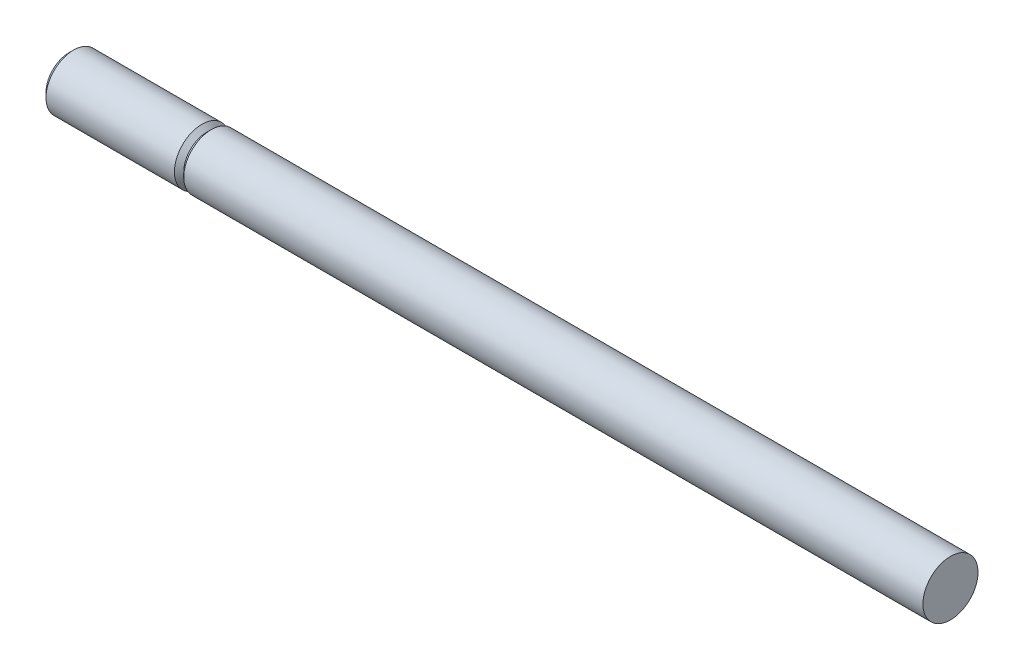
ISO-10303-21;
HEADER;
FILE_DESCRIPTION(('STEP AP214'),'2;1');
FILE_NAME('part.step','',(''),(''),'','','');
FILE_SCHEMA(('AUTOMOTIVE_DESIGN { 1 0 10303 214 1 1 1 1 }'));
ENDSEC;
DATA;
#1=APPLICATION_CONTEXT('core data for automotive mechanical design processes');
#2=APPLICATION_PROTOCOL_DEFINITION('international standard','automotive_design',2000,#1);
#3=PRODUCT_CONTEXT('',#1,'mechanical');
#4=PRODUCT('Part','Part','',(#3));
#5=PRODUCT_RELATED_PRODUCT_CATEGORY('part','',(#4));
#6=PRODUCT_DEFINITION_FORMATION('','',#4);
#7=PRODUCT_DEFINITION_CONTEXT('part definition',#1,'design');
#8=PRODUCT_DEFINITION('design','',#6,#7);
#9=PRODUCT_DEFINITION_SHAPE('','',#8);
#10=(LENGTH_UNIT() NAMED_UNIT(*) SI_UNIT(.MILLI.,.METRE.));
#11=(NAMED_UNIT(*) PLANE_ANGLE_UNIT() SI_UNIT($,.RADIAN.));
#12=(NAMED_UNIT(*) SI_UNIT($,.STERADIAN.) SOLID_ANGLE_UNIT());
#13=UNCERTAINTY_MEASURE_WITH_UNIT(LENGTH_MEASURE(1.E-05),#10,'distance_accuracy_value','');
#14=(GEOMETRIC_REPRESENTATION_CONTEXT(3) GLOBAL_UNCERTAINTY_ASSIGNED_CONTEXT((#13)) GLOBAL_UNIT_ASSIGNED_CONTEXT((#10,
#11,#12)) REPRESENTATION_CONTEXT('',''));
#15=CARTESIAN_POINT('',(0.,0.,0.));
#16=DIRECTION('',(0.,0.,1.));
#17=DIRECTION('',(1.,0.,0.));
#18=AXIS2_PLACEMENT_3D('',#15,#16,#17);
#19=CARTESIAN_POINT('',(100.,2.,0.));
#20=DIRECTION('',(1.,0.,0.));
#21=DIRECTION('',(0.,1.,0.));
#22=AXIS2_PLACEMENT_3D('',#19,#20,#21);
#23=PLANE('',#22);
#24=CARTESIAN_POINT('',(100.,0.,0.));
#25=DIRECTION('',(1.,0.,0.));
#26=DIRECTION('',(0.,1.,0.));
#27=AXIS2_PLACEMENT_3D('',#24,#25,#26);
#28=CIRCLE('',#27,4.);
#29=CARTESIAN_POINT('',(100.,4.,0.));
#30=VERTEX_POINT('',#29);
#31=EDGE_CURVE('E11',#30,#30,#28,.T.);
#32=ORIENTED_EDGE('',*,*,#31,.T.);
#33=EDGE_LOOP('',(#32));
#34=FACE_BOUND('',#33,.T.);
#35=ADVANCED_FACE('F17',(#34),#23,.T.);
#36=CARTESIAN_POINT('',(46.33828125,0.,0.));
#37=DIRECTION('',(-1.,0.,0.));
#38=DIRECTION('',(0.,1.,0.));
#39=AXIS2_PLACEMENT_3D('',#36,#37,#38);
#40=CYLINDRICAL_SURFACE('',#39,4.);
#41=CARTESIAN_POINT('',(-7.32343749999996,0.,0.));
#42=DIRECTION('',(1.,0.,0.));
#43=DIRECTION('',(0.,1.,0.));
#44=AXIS2_PLACEMENT_3D('',#41,#42,#43);
#45=CIRCLE('',#44,4.);
#46=CARTESIAN_POINT('',(-7.32343749999996,4.,0.));
#47=VERTEX_POINT('',#46);
#48=EDGE_CURVE('E25',#47,#47,#45,.T.);
#49=ORIENTED_EDGE('',*,*,#48,.T.);
#50=EDGE_LOOP('',(#49));
#51=FACE_BOUND('',#50,.T.);
#52=ORIENTED_EDGE('',*,*,#31,.F.);
#53=EDGE_LOOP('',(#52));
#54=FACE_BOUND('',#53,.T.);
#55=ADVANCED_FACE('F74',(#51,#54),#40,.T.);
#56=CARTESIAN_POINT('',(-7.66171874999998,0.,0.));
#57=DIRECTION('',(1.,0.,0.));
#58=DIRECTION('',(0.,1.,0.));
#59=AXIS2_PLACEMENT_3D('',#56,#57,#58);
#60=CONICAL_SURFACE('',#59,3.66171875,0.785398163397426);
#61=CARTESIAN_POINT('',(-8.,0.,0.));
#62=DIRECTION('',(1.,0.,0.));
#63=DIRECTION('',(0.,1.,0.));
#64=AXIS2_PLACEMENT_3D('',#61,#62,#63);
#65=CIRCLE('',#64,3.3234375);
#66=CARTESIAN_POINT('',(-8.,3.3234375,0.));
#67=VERTEX_POINT('',#66);
#68=EDGE_CURVE('E50',#67,#67,#65,.T.);
#69=ORIENTED_EDGE('',*,*,#68,.T.);
#70=EDGE_LOOP('',(#69));
#71=FACE_BOUND('',#70,.T.);
#72=ORIENTED_EDGE('',*,*,#48,.F.);
#73=EDGE_LOOP('',(#72));
#74=FACE_BOUND('',#73,.T.);
#75=ADVANCED_FACE('F19',(#71,#74),#60,.T.);
#76=CARTESIAN_POINT('',(-8.33828124999999,0.,0.));
#77=DIRECTION('',(-1.,0.,0.));
#78=DIRECTION('',(0.,1.,0.));
#79=AXIS2_PLACEMENT_3D('',#76,#77,#78);
#80=CONICAL_SURFACE('',#79,3.66171875,0.785398163397446);
#81=CARTESIAN_POINT('',(-8.67656249999999,0.,0.));
#82=DIRECTION('',(1.,0.,0.));
#83=DIRECTION('',(0.,1.,0.));
#84=AXIS2_PLACEMENT_3D('',#81,#82,#83);
#85=CIRCLE('',#84,4.);
#86=CARTESIAN_POINT('',(-8.67656249999999,4.,0.));
#87=VERTEX_POINT('',#86);
#88=EDGE_CURVE('E46',#87,#87,#85,.T.);
#89=ORIENTED_EDGE('',*,*,#88,.T.);
#90=EDGE_LOOP('',(#89));
#91=FACE_BOUND('',#90,.T.);
#92=ORIENTED_EDGE('',*,*,#68,.F.);
#93=EDGE_LOOP('',(#92));
#94=FACE_BOUND('',#93,.T.);
#95=ADVANCED_FACE('F47',(#91,#94),#80,.T.);
#96=CARTESIAN_POINT('',(-18.,0.,0.));
#97=DIRECTION('',(-1.,0.,0.));
#98=DIRECTION('',(0.,1.,0.));
#99=AXIS2_PLACEMENT_3D('',#96,#97,#98);
#100=CYLINDRICAL_SURFACE('',#99,4.);
#101=CARTESIAN_POINT('',(-27.3234375,0.,0.));
#102=DIRECTION('',(1.,0.,0.));
#103=DIRECTION('',(0.,1.,0.));
#104=AXIS2_PLACEMENT_3D('',#101,#102,#103);
#105=CIRCLE('',#104,4.);
#106=CARTESIAN_POINT('',(-27.3234375,4.,0.));
#107=VERTEX_POINT('',#106);
#108=EDGE_CURVE('E51',#107,#107,#105,.T.);
#109=ORIENTED_EDGE('',*,*,#108,.T.);
#110=EDGE_LOOP('',(#109));
#111=FACE_BOUND('',#110,.T.);
#112=ORIENTED_EDGE('',*,*,#88,.F.);
#113=EDGE_LOOP('',(#112));
#114=FACE_BOUND('',#113,.T.);
#115=ADVANCED_FACE('F69',(#111,#114),#100,.T.);
#116=CARTESIAN_POINT('',(-27.66171875,0.,0.));
#117=DIRECTION('',(1.,0.,0.));
#118=DIRECTION('',(0.,1.,0.));
#119=AXIS2_PLACEMENT_3D('',#116,#117,#118);
#120=CONICAL_SURFACE('',#119,3.66171875,0.785398163397446);
#121=CARTESIAN_POINT('',(-28.,0.,0.));
#122=DIRECTION('',(1.,0.,0.));
#123=DIRECTION('',(0.,1.,0.));
#124=AXIS2_PLACEMENT_3D('',#121,#122,#123);
#125=CIRCLE('',#124,3.3234375);
#126=CARTESIAN_POINT('',(-28.,3.3234375,0.));
#127=VERTEX_POINT('',#126);
#128=EDGE_CURVE('E53',#127,#127,#125,.T.);
#129=ORIENTED_EDGE('',*,*,#128,.T.);
#130=EDGE_LOOP('',(#129));
#131=FACE_BOUND('',#130,.T.);
#132=ORIENTED_EDGE('',*,*,#108,.F.);
#133=EDGE_LOOP('',(#132));
#134=FACE_BOUND('',#133,.T.);
#135=ADVANCED_FACE('F59',(#131,#134),#120,.T.);
#136=CARTESIAN_POINT('',(-28.,1.66171875,0.));
#137=DIRECTION('',(-1.,0.,0.));
#138=DIRECTION('',(0.,-1.,0.));
#139=AXIS2_PLACEMENT_3D('',#136,#137,#138);
#140=PLANE('',#139);
#141=ORIENTED_EDGE('',*,*,#128,.F.);
#142=EDGE_LOOP('',(#141));
#143=FACE_BOUND('',#142,.T.);
#144=ADVANCED_FACE('F62',(#143),#140,.T.);
#145=CLOSED_SHELL('',(#35,#55,#75,#95,#115,#135,#144));
#146=MANIFOLD_SOLID_BREP('B1',#145);
#147=ADVANCED_BREP_SHAPE_REPRESENTATION('',(#18,#146),#14);
#148=SHAPE_DEFINITION_REPRESENTATION(#9,#147);
ENDSEC;
END-ISO-10303-21;
